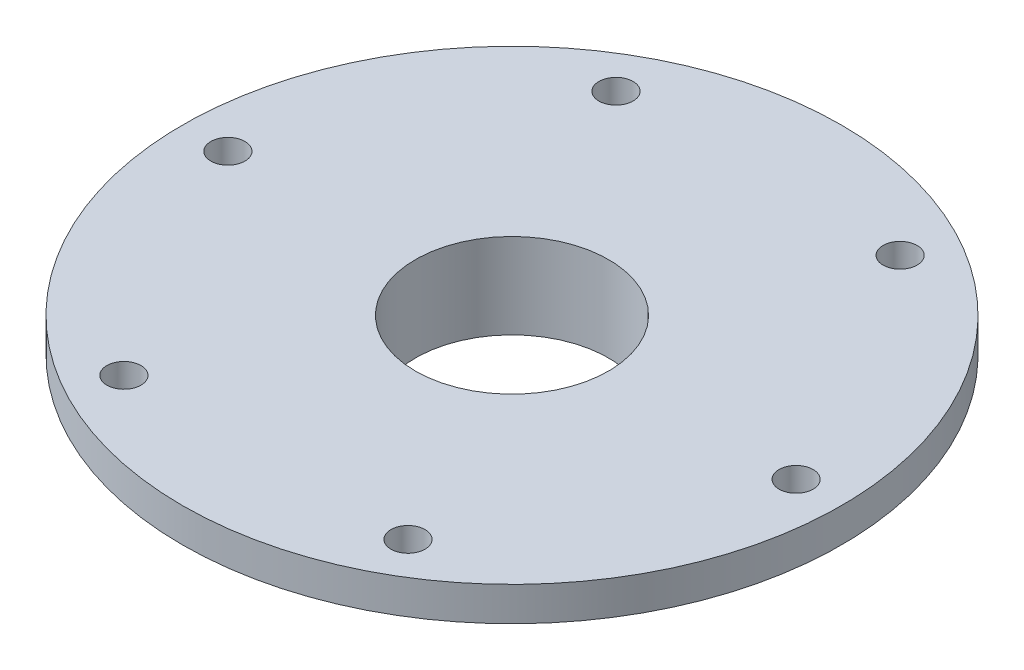
ISO-10303-21;
HEADER;
FILE_DESCRIPTION(('STEP AP214'),'2;1');
FILE_NAME('part.step','',(''),(''),'','','');
FILE_SCHEMA(('AUTOMOTIVE_DESIGN { 1 0 10303 214 1 1 1 1 }'));
ENDSEC;
DATA;
#1=APPLICATION_CONTEXT('core data for automotive mechanical design processes');
#2=APPLICATION_PROTOCOL_DEFINITION('international standard','automotive_design',2000,#1);
#3=PRODUCT_CONTEXT('',#1,'mechanical');
#4=PRODUCT('Part','Part','',(#3));
#5=PRODUCT_RELATED_PRODUCT_CATEGORY('part','',(#4));
#6=PRODUCT_DEFINITION_FORMATION('','',#4);
#7=PRODUCT_DEFINITION_CONTEXT('part definition',#1,'design');
#8=PRODUCT_DEFINITION('design','',#6,#7);
#9=PRODUCT_DEFINITION_SHAPE('','',#8);
#10=(LENGTH_UNIT() NAMED_UNIT(*) SI_UNIT(.MILLI.,.METRE.));
#11=(NAMED_UNIT(*) PLANE_ANGLE_UNIT() SI_UNIT($,.RADIAN.));
#12=(NAMED_UNIT(*) SI_UNIT($,.STERADIAN.) SOLID_ANGLE_UNIT());
#13=UNCERTAINTY_MEASURE_WITH_UNIT(LENGTH_MEASURE(1.E-05),#10,'distance_accuracy_value','');
#14=(GEOMETRIC_REPRESENTATION_CONTEXT(3) GLOBAL_UNCERTAINTY_ASSIGNED_CONTEXT((#13)) GLOBAL_UNIT_ASSIGNED_CONTEXT((#10,
#11,#12)) REPRESENTATION_CONTEXT('',''));
#15=CARTESIAN_POINT('',(0.,0.,0.));
#16=DIRECTION('',(0.,0.,1.));
#17=DIRECTION('',(1.,0.,0.));
#18=AXIS2_PLACEMENT_3D('',#15,#16,#17);
#19=CARTESIAN_POINT('',(0.,27.2792430533376,0.));
#20=DIRECTION('',(0.,1.,0.));
#21=DIRECTION('',(0.,0.,1.));
#22=AXIS2_PLACEMENT_3D('',#19,#20,#21);
#23=CYLINDRICAL_SURFACE('',#22,8.5);
#24=CARTESIAN_POINT('',(0.,0.,0.));
#25=DIRECTION('',(0.,1.,0.));
#26=DIRECTION('',(0.,0.,1.));
#27=AXIS2_PLACEMENT_3D('',#24,#25,#26);
#28=CIRCLE('',#27,8.5);
#29=CARTESIAN_POINT('',(0.,0.,8.5));
#30=VERTEX_POINT('',#29);
#31=EDGE_CURVE('E10',#30,#30,#28,.T.);
#32=ORIENTED_EDGE('',*,*,#31,.T.);
#33=EDGE_LOOP('',(#32));
#34=FACE_BOUND('',#33,.T.);
#35=CARTESIAN_POINT('',(0.,-7.5,0.));
#36=DIRECTION('',(0.,1.,0.));
#37=DIRECTION('',(0.,0.,1.));
#38=AXIS2_PLACEMENT_3D('',#35,#36,#37);
#39=CIRCLE('',#38,8.49999999999999);
#40=CARTESIAN_POINT('',(0.,-7.5,8.49999999999999));
#41=VERTEX_POINT('',#40);
#42=EDGE_CURVE('E68',#41,#41,#39,.T.);
#43=ORIENTED_EDGE('',*,*,#42,.F.);
#44=EDGE_LOOP('',(#43));
#45=FACE_BOUND('',#44,.T.);
#46=ADVANCED_FACE('F35',(#34,#45),#23,.F.);
#47=CARTESIAN_POINT('',(-8.5,0.,0.));
#48=DIRECTION('',(0.,1.,0.));
#49=DIRECTION('',(0.,0.,1.));
#50=AXIS2_PLACEMENT_3D('',#47,#48,#49);
#51=PLANE('',#50);
#52=CARTESIAN_POINT('',(-25.,0.,0.));
#53=DIRECTION('',(0.,1.,0.));
#54=DIRECTION('',(0.,0.,1.));
#55=AXIS2_PLACEMENT_3D('',#52,#53,#54);
#56=CIRCLE('',#55,1.5);
#57=CARTESIAN_POINT('',(-25.,0.,1.5));
#58=VERTEX_POINT('',#57);
#59=EDGE_CURVE('E55',#58,#58,#56,.T.);
#60=ORIENTED_EDGE('',*,*,#59,.F.);
#61=EDGE_LOOP('',(#60));
#62=FACE_BOUND('',#61,.T.);
#63=CARTESIAN_POINT('',(-12.5,0.,21.650635094611));
#64=DIRECTION('',(0.,1.,0.));
#65=DIRECTION('',(0.,0.,1.));
#66=AXIS2_PLACEMENT_3D('',#63,#64,#65);
#67=CIRCLE('',#66,1.5);
#68=CARTESIAN_POINT('',(-12.5,0.,23.150635094611));
#69=VERTEX_POINT('',#68);
#70=EDGE_CURVE('E119',#69,#69,#67,.T.);
#71=ORIENTED_EDGE('',*,*,#70,.F.);
#72=EDGE_LOOP('',(#71));
#73=FACE_BOUND('',#72,.T.);
#74=CARTESIAN_POINT('',(12.5,0.,21.650635094611));
#75=DIRECTION('',(0.,1.,0.));
#76=DIRECTION('',(0.,0.,1.));
#77=AXIS2_PLACEMENT_3D('',#74,#75,#76);
#78=CIRCLE('',#77,1.5);
#79=CARTESIAN_POINT('',(12.5,0.,23.150635094611));
#80=VERTEX_POINT('',#79);
#81=EDGE_CURVE('E80',#80,#80,#78,.T.);
#82=ORIENTED_EDGE('',*,*,#81,.F.);
#83=EDGE_LOOP('',(#82));
#84=FACE_BOUND('',#83,.T.);
#85=CARTESIAN_POINT('',(25.,0.,0.));
#86=DIRECTION('',(0.,1.,0.));
#87=DIRECTION('',(0.,0.,1.));
#88=AXIS2_PLACEMENT_3D('',#85,#86,#87);
#89=CIRCLE('',#88,1.5);
#90=CARTESIAN_POINT('',(25.,0.,1.5));
#91=VERTEX_POINT('',#90);
#92=EDGE_CURVE('E126',#91,#91,#89,.T.);
#93=ORIENTED_EDGE('',*,*,#92,.F.);
#94=EDGE_LOOP('',(#93));
#95=FACE_BOUND('',#94,.T.);
#96=CARTESIAN_POINT('',(12.5,0.,-21.650635094611));
#97=DIRECTION('',(0.,1.,0.));
#98=DIRECTION('',(0.,0.,1.));
#99=AXIS2_PLACEMENT_3D('',#96,#97,#98);
#100=CIRCLE('',#99,1.5);
#101=CARTESIAN_POINT('',(12.5,0.,-20.150635094611));
#102=VERTEX_POINT('',#101);
#103=EDGE_CURVE('E130',#102,#102,#100,.T.);
#104=ORIENTED_EDGE('',*,*,#103,.F.);
#105=EDGE_LOOP('',(#104));
#106=FACE_BOUND('',#105,.T.);
#107=CARTESIAN_POINT('',(-12.5,0.,-21.650635094611));
#108=DIRECTION('',(0.,1.,0.));
#109=DIRECTION('',(0.,0.,1.));
#110=AXIS2_PLACEMENT_3D('',#107,#108,#109);
#111=CIRCLE('',#110,1.5);
#112=CARTESIAN_POINT('',(-12.5,0.,-20.150635094611));
#113=VERTEX_POINT('',#112);
#114=EDGE_CURVE('E134',#113,#113,#111,.T.);
#115=ORIENTED_EDGE('',*,*,#114,.F.);
#116=EDGE_LOOP('',(#115));
#117=FACE_BOUND('',#116,.T.);
#118=CARTESIAN_POINT('',(0.,0.,0.));
#119=DIRECTION('',(0.,1.,0.));
#120=DIRECTION('',(0.,0.,1.));
#121=AXIS2_PLACEMENT_3D('',#118,#119,#120);
#122=CIRCLE('',#121,29.);
#123=CARTESIAN_POINT('',(0.,0.,29.));
#124=VERTEX_POINT('',#123);
#125=EDGE_CURVE('E42',#124,#124,#122,.T.);
#126=ORIENTED_EDGE('',*,*,#125,.T.);
#127=EDGE_LOOP('',(#126));
#128=FACE_BOUND('',#127,.T.);
#129=ORIENTED_EDGE('',*,*,#31,.F.);
#130=EDGE_LOOP('',(#129));
#131=FACE_BOUND('',#130,.T.);
#132=ADVANCED_FACE('F102',(#62,#73,#84,#95,#106,#117,#128,#131),#51,.T.);
#133=CARTESIAN_POINT('',(0.,27.2792430533376,0.));
#134=DIRECTION('',(0.,1.,0.));
#135=DIRECTION('',(0.,0.,1.));
#136=AXIS2_PLACEMENT_3D('',#133,#134,#135);
#137=CYLINDRICAL_SURFACE('',#136,29.);
#138=CARTESIAN_POINT('',(0.,-3.,0.));
#139=DIRECTION('',(0.,1.,0.));
#140=DIRECTION('',(0.,0.,1.));
#141=AXIS2_PLACEMENT_3D('',#138,#139,#140);
#142=CIRCLE('',#141,29.);
#143=CARTESIAN_POINT('',(0.,-3.,29.));
#144=VERTEX_POINT('',#143);
#145=EDGE_CURVE('E47',#144,#144,#142,.T.);
#146=ORIENTED_EDGE('',*,*,#145,.T.);
#147=EDGE_LOOP('',(#146));
#148=FACE_BOUND('',#147,.T.);
#149=ORIENTED_EDGE('',*,*,#125,.F.);
#150=EDGE_LOOP('',(#149));
#151=FACE_BOUND('',#150,.T.);
#152=ADVANCED_FACE('F87',(#148,#151),#137,.T.);
#153=CARTESIAN_POINT('',(-29.,-3.,0.));
#154=DIRECTION('',(0.,-1.,0.));
#155=DIRECTION('',(0.,0.,-1.));
#156=AXIS2_PLACEMENT_3D('',#153,#154,#155);
#157=PLANE('',#156);
#158=CARTESIAN_POINT('',(-25.,-3.,0.));
#159=DIRECTION('',(0.,-1.,0.));
#160=DIRECTION('',(0.,0.,-1.));
#161=AXIS2_PLACEMENT_3D('',#158,#159,#160);
#162=CIRCLE('',#161,1.5);
#163=CARTESIAN_POINT('',(-25.,-3.,-1.5));
#164=VERTEX_POINT('',#163);
#165=EDGE_CURVE('E38',#164,#164,#162,.T.);
#166=ORIENTED_EDGE('',*,*,#165,.F.);
#167=EDGE_LOOP('',(#166));
#168=FACE_BOUND('',#167,.T.);
#169=CARTESIAN_POINT('',(-12.5,-3.,21.650635094611));
#170=DIRECTION('',(0.,-1.,0.));
#171=DIRECTION('',(0.,0.,-1.));
#172=AXIS2_PLACEMENT_3D('',#169,#170,#171);
#173=CIRCLE('',#172,1.5);
#174=CARTESIAN_POINT('',(-12.5,-3.,20.150635094611));
#175=VERTEX_POINT('',#174);
#176=EDGE_CURVE('E63',#175,#175,#173,.T.);
#177=ORIENTED_EDGE('',*,*,#176,.F.);
#178=EDGE_LOOP('',(#177));
#179=FACE_BOUND('',#178,.T.);
#180=CARTESIAN_POINT('',(12.5,-3.,21.650635094611));
#181=DIRECTION('',(0.,-1.,0.));
#182=DIRECTION('',(0.,0.,-1.));
#183=AXIS2_PLACEMENT_3D('',#180,#181,#182);
#184=CIRCLE('',#183,1.5);
#185=CARTESIAN_POINT('',(12.5,-3.,20.150635094611));
#186=VERTEX_POINT('',#185);
#187=EDGE_CURVE('E61',#186,#186,#184,.T.);
#188=ORIENTED_EDGE('',*,*,#187,.F.);
#189=EDGE_LOOP('',(#188));
#190=FACE_BOUND('',#189,.T.);
#191=CARTESIAN_POINT('',(25.,-3.,0.));
#192=DIRECTION('',(0.,-1.,0.));
#193=DIRECTION('',(0.,0.,-1.));
#194=AXIS2_PLACEMENT_3D('',#191,#192,#193);
#195=CIRCLE('',#194,1.5);
#196=CARTESIAN_POINT('',(25.,-3.,-1.5));
#197=VERTEX_POINT('',#196);
#198=EDGE_CURVE('E58',#197,#197,#195,.T.);
#199=ORIENTED_EDGE('',*,*,#198,.F.);
#200=EDGE_LOOP('',(#199));
#201=FACE_BOUND('',#200,.T.);
#202=CARTESIAN_POINT('',(12.5,-3.,-21.650635094611));
#203=DIRECTION('',(0.,-1.,0.));
#204=DIRECTION('',(0.,0.,-1.));
#205=AXIS2_PLACEMENT_3D('',#202,#203,#204);
#206=CIRCLE('',#205,1.5);
#207=CARTESIAN_POINT('',(12.5,-3.,-23.150635094611));
#208=VERTEX_POINT('',#207);
#209=EDGE_CURVE('E54',#208,#208,#206,.T.);
#210=ORIENTED_EDGE('',*,*,#209,.F.);
#211=EDGE_LOOP('',(#210));
#212=FACE_BOUND('',#211,.T.);
#213=CARTESIAN_POINT('',(-12.5,-3.,-21.650635094611));
#214=DIRECTION('',(0.,-1.,0.));
#215=DIRECTION('',(0.,0.,-1.));
#216=AXIS2_PLACEMENT_3D('',#213,#214,#215);
#217=CIRCLE('',#216,1.5);
#218=CARTESIAN_POINT('',(-12.5,-3.,-23.150635094611));
#219=VERTEX_POINT('',#218);
#220=EDGE_CURVE('E51',#219,#219,#217,.T.);
#221=ORIENTED_EDGE('',*,*,#220,.F.);
#222=EDGE_LOOP('',(#221));
#223=FACE_BOUND('',#222,.T.);
#224=CARTESIAN_POINT('',(0.,-3.,0.));
#225=DIRECTION('',(0.,1.,0.));
#226=DIRECTION('',(0.,0.,1.));
#227=AXIS2_PLACEMENT_3D('',#224,#225,#226);
#228=CIRCLE('',#227,11.75);
#229=CARTESIAN_POINT('',(0.,-3.,11.75));
#230=VERTEX_POINT('',#229);
#231=EDGE_CURVE('E77',#230,#230,#228,.T.);
#232=ORIENTED_EDGE('',*,*,#231,.T.);
#233=EDGE_LOOP('',(#232));
#234=FACE_BOUND('',#233,.T.);
#235=ORIENTED_EDGE('',*,*,#145,.F.);
#236=EDGE_LOOP('',(#235));
#237=FACE_BOUND('',#236,.T.);
#238=ADVANCED_FACE('F90',(#168,#179,#190,#201,#212,#223,#234,#237),#157,.T.);
#239=CARTESIAN_POINT('',(0.,27.2792430533376,0.));
#240=DIRECTION('',(0.,1.,0.));
#241=DIRECTION('',(0.,0.,1.));
#242=AXIS2_PLACEMENT_3D('',#239,#240,#241);
#243=CYLINDRICAL_SURFACE('',#242,11.75);
#244=CARTESIAN_POINT('',(0.,-7.5,0.));
#245=DIRECTION('',(0.,1.,0.));
#246=DIRECTION('',(0.,0.,1.));
#247=AXIS2_PLACEMENT_3D('',#244,#245,#246);
#248=CIRCLE('',#247,11.75);
#249=CARTESIAN_POINT('',(0.,-7.5,11.75));
#250=VERTEX_POINT('',#249);
#251=EDGE_CURVE('E72',#250,#250,#248,.T.);
#252=ORIENTED_EDGE('',*,*,#251,.T.);
#253=EDGE_LOOP('',(#252));
#254=FACE_BOUND('',#253,.T.);
#255=ORIENTED_EDGE('',*,*,#231,.F.);
#256=EDGE_LOOP('',(#255));
#257=FACE_BOUND('',#256,.T.);
#258=ADVANCED_FACE('F92',(#254,#257),#243,.T.);
#259=CARTESIAN_POINT('',(-11.75,-7.5,0.));
#260=DIRECTION('',(0.,-1.,0.));
#261=DIRECTION('',(0.,0.,-1.));
#262=AXIS2_PLACEMENT_3D('',#259,#260,#261);
#263=PLANE('',#262);
#264=ORIENTED_EDGE('',*,*,#42,.T.);
#265=EDGE_LOOP('',(#264));
#266=FACE_BOUND('',#265,.T.);
#267=ORIENTED_EDGE('',*,*,#251,.F.);
#268=EDGE_LOOP('',(#267));
#269=FACE_BOUND('',#268,.T.);
#270=ADVANCED_FACE('F99',(#266,#269),#263,.T.);
#271=CARTESIAN_POINT('',(-12.5,-7.5,-21.650635094611));
#272=DIRECTION('',(0.,1.,0.));
#273=DIRECTION('',(0.,0.,1.));
#274=AXIS2_PLACEMENT_3D('',#271,#272,#273);
#275=CYLINDRICAL_SURFACE('',#274,1.5);
#276=ORIENTED_EDGE('',*,*,#220,.T.);
#277=EDGE_LOOP('',(#276));
#278=FACE_BOUND('',#277,.T.);
#279=ORIENTED_EDGE('',*,*,#114,.T.);
#280=EDGE_LOOP('',(#279));
#281=FACE_BOUND('',#280,.T.);
#282=ADVANCED_FACE('F159',(#278,#281),#275,.F.);
#283=CARTESIAN_POINT('',(12.5,-7.5,-21.650635094611));
#284=DIRECTION('',(0.,1.,0.));
#285=DIRECTION('',(0.,0.,1.));
#286=AXIS2_PLACEMENT_3D('',#283,#284,#285);
#287=CYLINDRICAL_SURFACE('',#286,1.5);
#288=ORIENTED_EDGE('',*,*,#209,.T.);
#289=EDGE_LOOP('',(#288));
#290=FACE_BOUND('',#289,.T.);
#291=ORIENTED_EDGE('',*,*,#103,.T.);
#292=EDGE_LOOP('',(#291));
#293=FACE_BOUND('',#292,.T.);
#294=ADVANCED_FACE('F162',(#290,#293),#287,.F.);
#295=CARTESIAN_POINT('',(25.,-7.5,0.));
#296=DIRECTION('',(0.,1.,0.));
#297=DIRECTION('',(0.,0.,1.));
#298=AXIS2_PLACEMENT_3D('',#295,#296,#297);
#299=CYLINDRICAL_SURFACE('',#298,1.5);
#300=ORIENTED_EDGE('',*,*,#198,.T.);
#301=EDGE_LOOP('',(#300));
#302=FACE_BOUND('',#301,.T.);
#303=ORIENTED_EDGE('',*,*,#92,.T.);
#304=EDGE_LOOP('',(#303));
#305=FACE_BOUND('',#304,.T.);
#306=ADVANCED_FACE('F155',(#302,#305),#299,.F.);
#307=CARTESIAN_POINT('',(12.5,-7.5,21.650635094611));
#308=DIRECTION('',(0.,1.,0.));
#309=DIRECTION('',(0.,0.,1.));
#310=AXIS2_PLACEMENT_3D('',#307,#308,#309);
#311=CYLINDRICAL_SURFACE('',#310,1.5);
#312=ORIENTED_EDGE('',*,*,#187,.T.);
#313=EDGE_LOOP('',(#312));
#314=FACE_BOUND('',#313,.T.);
#315=ORIENTED_EDGE('',*,*,#81,.T.);
#316=EDGE_LOOP('',(#315));
#317=FACE_BOUND('',#316,.T.);
#318=ADVANCED_FACE('F148',(#314,#317),#311,.F.);
#319=CARTESIAN_POINT('',(-12.5,-7.5,21.650635094611));
#320=DIRECTION('',(0.,1.,0.));
#321=DIRECTION('',(0.,0.,1.));
#322=AXIS2_PLACEMENT_3D('',#319,#320,#321);
#323=CYLINDRICAL_SURFACE('',#322,1.5);
#324=ORIENTED_EDGE('',*,*,#176,.T.);
#325=EDGE_LOOP('',(#324));
#326=FACE_BOUND('',#325,.T.);
#327=ORIENTED_EDGE('',*,*,#70,.T.);
#328=EDGE_LOOP('',(#327));
#329=FACE_BOUND('',#328,.T.);
#330=ADVANCED_FACE('F145',(#326,#329),#323,.F.);
#331=CARTESIAN_POINT('',(-25.,-7.5,0.));
#332=DIRECTION('',(0.,1.,0.));
#333=DIRECTION('',(0.,0.,1.));
#334=AXIS2_PLACEMENT_3D('',#331,#332,#333);
#335=CYLINDRICAL_SURFACE('',#334,1.5);
#336=ORIENTED_EDGE('',*,*,#165,.T.);
#337=EDGE_LOOP('',(#336));
#338=FACE_BOUND('',#337,.T.);
#339=ORIENTED_EDGE('',*,*,#59,.T.);
#340=EDGE_LOOP('',(#339));
#341=FACE_BOUND('',#340,.T.);
#342=ADVANCED_FACE('F147',(#338,#341),#335,.F.);
#343=CLOSED_SHELL('',(#46,#132,#152,#238,#258,#270,#282,#294,#306,#318,#330,#342));
#344=MANIFOLD_SOLID_BREP('B2',#343);
#345=ADVANCED_BREP_SHAPE_REPRESENTATION('',(#18,#344),#14);
#346=SHAPE_DEFINITION_REPRESENTATION(#9,#345);
ENDSEC;
END-ISO-10303-21;
